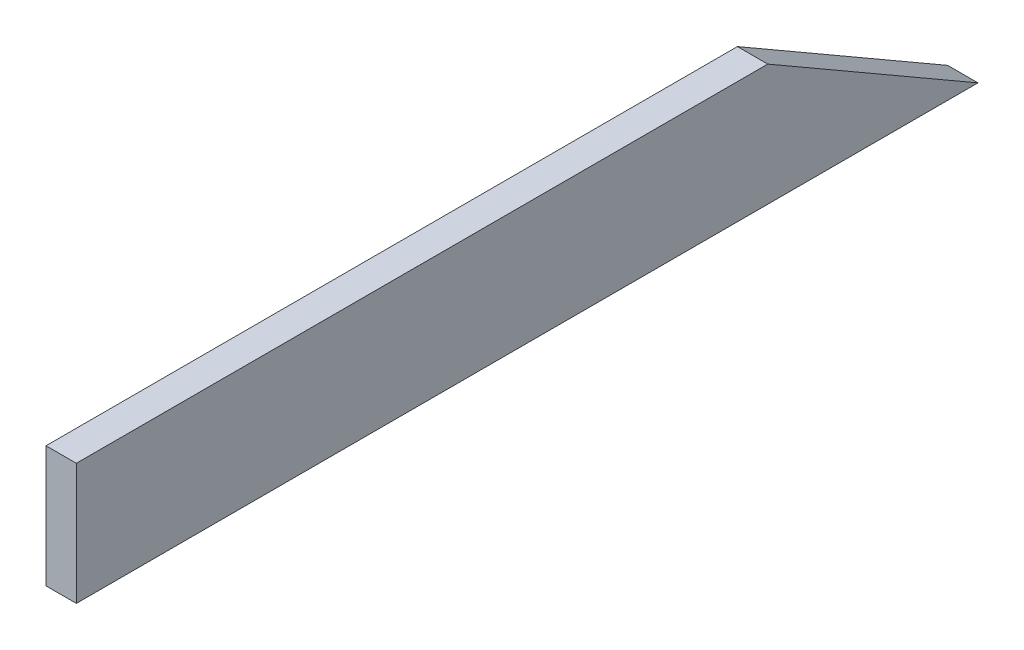
ISO-10303-21;
HEADER;
FILE_DESCRIPTION(('STEP AP214'),'2;1');
FILE_NAME('part.step','',(''),(''),'','','');
FILE_SCHEMA(('AUTOMOTIVE_DESIGN { 1 0 10303 214 1 1 1 1 }'));
ENDSEC;
DATA;
#1=APPLICATION_CONTEXT('core data for automotive mechanical design processes');
#2=APPLICATION_PROTOCOL_DEFINITION('international standard','automotive_design',2000,#1);
#3=PRODUCT_CONTEXT('',#1,'mechanical');
#4=PRODUCT('Part','Part','',(#3));
#5=PRODUCT_RELATED_PRODUCT_CATEGORY('part','',(#4));
#6=PRODUCT_DEFINITION_FORMATION('','',#4);
#7=PRODUCT_DEFINITION_CONTEXT('part definition',#1,'design');
#8=PRODUCT_DEFINITION('design','',#6,#7);
#9=PRODUCT_DEFINITION_SHAPE('','',#8);
#10=(LENGTH_UNIT() NAMED_UNIT(*) SI_UNIT(.MILLI.,.METRE.));
#11=(NAMED_UNIT(*) PLANE_ANGLE_UNIT() SI_UNIT($,.RADIAN.));
#12=(NAMED_UNIT(*) SI_UNIT($,.STERADIAN.) SOLID_ANGLE_UNIT());
#13=UNCERTAINTY_MEASURE_WITH_UNIT(LENGTH_MEASURE(1.E-05),#10,'distance_accuracy_value','');
#14=(GEOMETRIC_REPRESENTATION_CONTEXT(3) GLOBAL_UNCERTAINTY_ASSIGNED_CONTEXT((#13)) GLOBAL_UNIT_ASSIGNED_CONTEXT((#10,
#11,#12)) REPRESENTATION_CONTEXT('',''));
#15=CARTESIAN_POINT('',(0.,0.,0.));
#16=DIRECTION('',(0.,0.,1.));
#17=DIRECTION('',(1.,0.,0.));
#18=AXIS2_PLACEMENT_3D('',#15,#16,#17);
#19=CARTESIAN_POINT('',(0.,0.,0.));
#20=DIRECTION('',(0.,0.,-1.));
#21=DIRECTION('',(1.,0.,0.));
#22=AXIS2_PLACEMENT_3D('',#19,#20,#21);
#23=PLANE('',#22);
#24=DIRECTION('',(0.,-1.,0.));
#25=VECTOR('',#24,1.);
#26=CARTESIAN_POINT('',(0.,0.,0.));
#27=LINE('',#26,#25);
#28=CARTESIAN_POINT('',(0.,0.,0.));
#29=VERTEX_POINT('',#28);
#30=CARTESIAN_POINT('',(0.,-25.4,0.));
#31=VERTEX_POINT('',#30);
#32=EDGE_CURVE('E76',#29,#31,#27,.T.);
#33=ORIENTED_EDGE('',*,*,#32,.T.);
#34=DIRECTION('',(1.,0.,0.));
#35=VECTOR('',#34,1.);
#36=CARTESIAN_POINT('',(0.,-25.4,0.));
#37=LINE('',#36,#35);
#38=CARTESIAN_POINT('',(6.35,-25.4,0.));
#39=VERTEX_POINT('',#38);
#40=EDGE_CURVE('E79',#31,#39,#37,.T.);
#41=ORIENTED_EDGE('',*,*,#40,.T.);
#42=DIRECTION('',(0.,1.,0.));
#43=VECTOR('',#42,1.);
#44=CARTESIAN_POINT('',(6.35,0.,0.));
#45=LINE('',#44,#43);
#46=CARTESIAN_POINT('',(6.35,0.,0.));
#47=VERTEX_POINT('',#46);
#48=EDGE_CURVE('E85',#39,#47,#45,.T.);
#49=ORIENTED_EDGE('',*,*,#48,.T.);
#50=DIRECTION('',(-1.,0.,0.));
#51=VECTOR('',#50,1.);
#52=CARTESIAN_POINT('',(0.,0.,0.));
#53=LINE('',#52,#51);
#54=EDGE_CURVE('E89',#47,#29,#53,.T.);
#55=ORIENTED_EDGE('',*,*,#54,.T.);
#56=EDGE_LOOP('',(#33,#41,#49,#55));
#57=FACE_BOUND('',#56,.T.);
#58=ADVANCED_FACE('F35',(#57),#23,.F.);
#59=CARTESIAN_POINT('',(0.,0.,-205.951897876889));
#60=DIRECTION('',(0.,-1.,0.));
#61=DIRECTION('',(0.,0.,1.));
#62=AXIS2_PLACEMENT_3D('',#59,#60,#61);
#63=PLANE('',#62);
#64=DIRECTION('',(0.,0.,1.));
#65=VECTOR('',#64,1.);
#66=CARTESIAN_POINT('',(0.,0.,-205.951897876889));
#67=LINE('',#66,#65);
#68=CARTESIAN_POINT('',(0.,0.,-144.682271536756));
#69=VERTEX_POINT('',#68);
#70=EDGE_CURVE('E95',#69,#29,#67,.T.);
#71=ORIENTED_EDGE('',*,*,#70,.T.);
#72=ORIENTED_EDGE('',*,*,#54,.F.);
#73=DIRECTION('',(0.,0.,1.));
#74=VECTOR('',#73,1.);
#75=CARTESIAN_POINT('',(6.35,0.,-205.951897876889));
#76=LINE('',#75,#74);
#77=CARTESIAN_POINT('',(6.35,0.,-144.682271536756));
#78=VERTEX_POINT('',#77);
#79=EDGE_CURVE('E97',#78,#47,#76,.T.);
#80=ORIENTED_EDGE('',*,*,#79,.F.);
#81=DIRECTION('',(1.,0.,0.));
#82=VECTOR('',#81,1.);
#83=CARTESIAN_POINT('',(0.,0.,-144.682271536756));
#84=LINE('',#83,#82);
#85=EDGE_CURVE('E39',#69,#78,#84,.T.);
#86=ORIENTED_EDGE('',*,*,#85,.F.);
#87=EDGE_LOOP('',(#71,#72,#80,#86));
#88=FACE_BOUND('',#87,.T.);
#89=ADVANCED_FACE('F106',(#88),#63,.F.);
#90=CARTESIAN_POINT('',(6.35,0.,-205.951897876889));
#91=DIRECTION('',(-1.,0.,0.));
#92=DIRECTION('',(0.,-1.,0.));
#93=AXIS2_PLACEMENT_3D('',#90,#91,#92);
#94=PLANE('',#93);
#95=ORIENTED_EDGE('',*,*,#79,.T.);
#96=ORIENTED_EDGE('',*,*,#48,.F.);
#97=DIRECTION('',(0.,0.,1.));
#98=VECTOR('',#97,1.);
#99=CARTESIAN_POINT('',(6.35,-25.4,-205.951897876889));
#100=LINE('',#99,#98);
#101=CARTESIAN_POINT('',(6.35,-25.4,-188.676362049006));
#102=VERTEX_POINT('',#101);
#103=EDGE_CURVE('E77',#102,#39,#100,.T.);
#104=ORIENTED_EDGE('',*,*,#103,.F.);
#105=DIRECTION('',(0.,-0.499999999999998,-0.86602540378444));
#106=VECTOR('',#105,1.);
#107=CARTESIAN_POINT('',(6.35,-26.5305264454677,-190.634491291856));
#108=LINE('',#107,#106);
#109=EDGE_CURVE('E102',#78,#102,#108,.T.);
#110=ORIENTED_EDGE('',*,*,#109,.F.);
#111=EDGE_LOOP('',(#95,#96,#104,#110));
#112=FACE_BOUND('',#111,.T.);
#113=ADVANCED_FACE('F101',(#112),#94,.F.);
#114=CARTESIAN_POINT('',(0.,-25.4,-205.951897876889));
#115=DIRECTION('',(0.,1.,0.));
#116=DIRECTION('',(0.,0.,-1.));
#117=AXIS2_PLACEMENT_3D('',#114,#115,#116);
#118=PLANE('',#117);
#119=ORIENTED_EDGE('',*,*,#103,.T.);
#120=ORIENTED_EDGE('',*,*,#40,.F.);
#121=DIRECTION('',(0.,0.,1.));
#122=VECTOR('',#121,1.);
#123=CARTESIAN_POINT('',(0.,-25.4,-205.951897876889));
#124=LINE('',#123,#122);
#125=CARTESIAN_POINT('',(0.,-25.4,-188.676362049006));
#126=VERTEX_POINT('',#125);
#127=EDGE_CURVE('E73',#126,#31,#124,.T.);
#128=ORIENTED_EDGE('',*,*,#127,.F.);
#129=DIRECTION('',(-1.,0.,0.));
#130=VECTOR('',#129,1.);
#131=CARTESIAN_POINT('',(0.,-25.4,-188.676362049006));
#132=LINE('',#131,#130);
#133=EDGE_CURVE('E44',#102,#126,#132,.T.);
#134=ORIENTED_EDGE('',*,*,#133,.F.);
#135=EDGE_LOOP('',(#119,#120,#128,#134));
#136=FACE_BOUND('',#135,.T.);
#137=ADVANCED_FACE('F80',(#136),#118,.F.);
#138=CARTESIAN_POINT('',(0.,0.,-205.951897876889));
#139=DIRECTION('',(1.,0.,0.));
#140=DIRECTION('',(0.,1.,0.));
#141=AXIS2_PLACEMENT_3D('',#138,#139,#140);
#142=PLANE('',#141);
#143=ORIENTED_EDGE('',*,*,#127,.T.);
#144=ORIENTED_EDGE('',*,*,#32,.F.);
#145=ORIENTED_EDGE('',*,*,#70,.F.);
#146=DIRECTION('',(0.,0.499999999999998,0.86602540378444));
#147=VECTOR('',#146,1.);
#148=CARTESIAN_POINT('',(0.,-26.5305264454677,-190.634491291856));
#149=LINE('',#148,#147);
#150=EDGE_CURVE('E11',#126,#69,#149,.T.);
#151=ORIENTED_EDGE('',*,*,#150,.F.);
#152=EDGE_LOOP('',(#143,#144,#145,#151));
#153=FACE_BOUND('',#152,.T.);
#154=ADVANCED_FACE('F37',(#153),#142,.F.);
#155=CARTESIAN_POINT('',(-43.2494000000033,116.059984237306,56.3395178879013));
#156=DIRECTION('',(0.,-0.86602540378444,0.499999999999998));
#157=DIRECTION('',(1.,0.,0.));
#158=AXIS2_PLACEMENT_3D('',#155,#156,#157);
#159=PLANE('',#158);
#160=ORIENTED_EDGE('',*,*,#133,.T.);
#161=ORIENTED_EDGE('',*,*,#150,.T.);
#162=ORIENTED_EDGE('',*,*,#85,.T.);
#163=ORIENTED_EDGE('',*,*,#109,.T.);
#164=EDGE_LOOP('',(#160,#161,#162,#163));
#165=FACE_BOUND('',#164,.T.);
#166=ADVANCED_FACE('F109',(#165),#159,.F.);
#167=CLOSED_SHELL('',(#58,#89,#113,#137,#154,#166));
#168=MANIFOLD_SOLID_BREP('B2',#167);
#169=ADVANCED_BREP_SHAPE_REPRESENTATION('',(#18,#168),#14);
#170=SHAPE_DEFINITION_REPRESENTATION(#9,#169);
ENDSEC;
END-ISO-10303-21;
